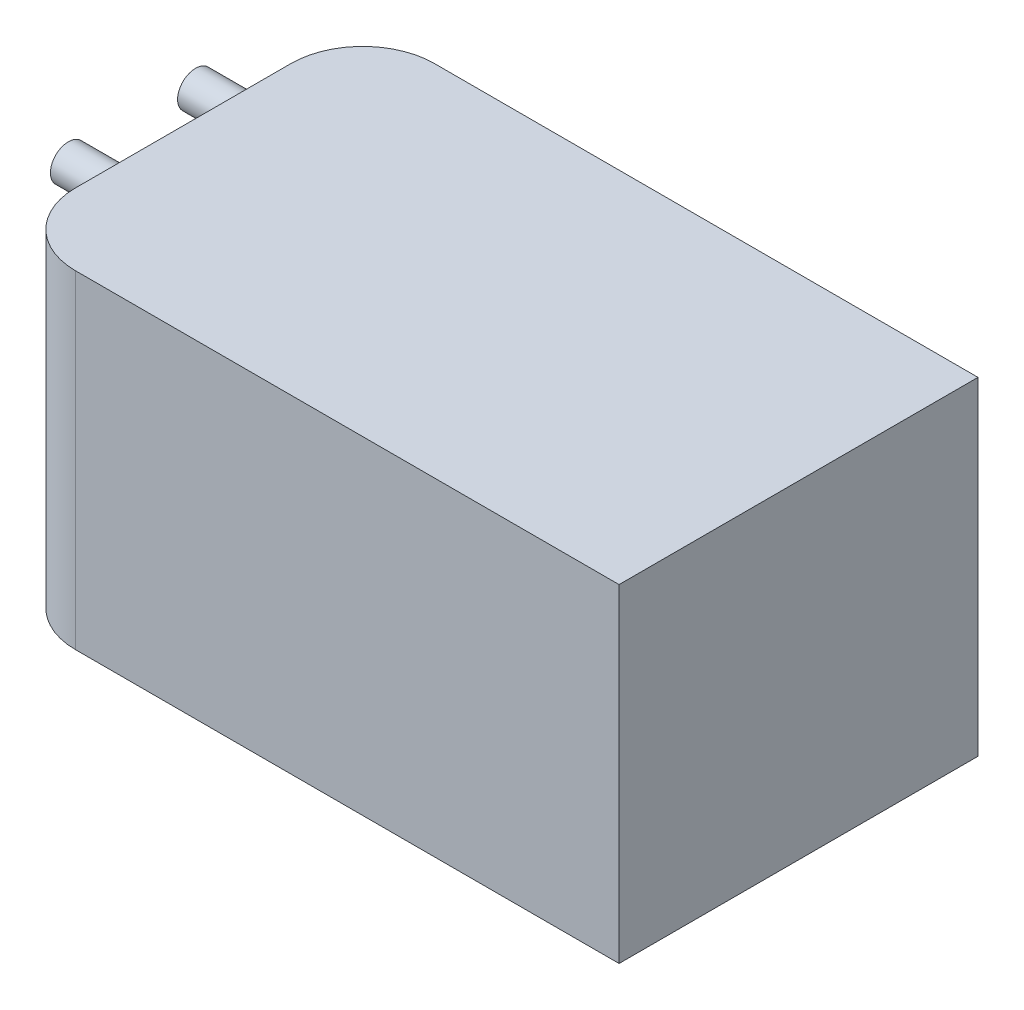
ISO-10303-21;
HEADER;
FILE_DESCRIPTION(('STEP AP214'),'2;1');
FILE_NAME('part.step','',(''),(''),'','','');
FILE_SCHEMA(('AUTOMOTIVE_DESIGN { 1 0 10303 214 1 1 1 1 }'));
ENDSEC;
DATA;
#1=APPLICATION_CONTEXT('core data for automotive mechanical design processes');
#2=APPLICATION_PROTOCOL_DEFINITION('international standard','automotive_design',2000,#1);
#3=PRODUCT_CONTEXT('',#1,'mechanical');
#4=PRODUCT('Part','Part','',(#3));
#5=PRODUCT_RELATED_PRODUCT_CATEGORY('part','',(#4));
#6=PRODUCT_DEFINITION_FORMATION('','',#4);
#7=PRODUCT_DEFINITION_CONTEXT('part definition',#1,'design');
#8=PRODUCT_DEFINITION('design','',#6,#7);
#9=PRODUCT_DEFINITION_SHAPE('','',#8);
#10=(LENGTH_UNIT() NAMED_UNIT(*) SI_UNIT(.MILLI.,.METRE.));
#11=(NAMED_UNIT(*) PLANE_ANGLE_UNIT() SI_UNIT($,.RADIAN.));
#12=(NAMED_UNIT(*) SI_UNIT($,.STERADIAN.) SOLID_ANGLE_UNIT());
#13=UNCERTAINTY_MEASURE_WITH_UNIT(LENGTH_MEASURE(1.E-05),#10,'distance_accuracy_value','');
#14=(GEOMETRIC_REPRESENTATION_CONTEXT(3) GLOBAL_UNCERTAINTY_ASSIGNED_CONTEXT((#13)) GLOBAL_UNIT_ASSIGNED_CONTEXT((#10,
#11,#12)) REPRESENTATION_CONTEXT('',''));
#15=CARTESIAN_POINT('',(0.,0.,0.));
#16=DIRECTION('',(0.,0.,1.));
#17=DIRECTION('',(1.,0.,0.));
#18=AXIS2_PLACEMENT_3D('',#15,#16,#17);
#19=CARTESIAN_POINT('',(30.,-16.,35.));
#20=DIRECTION('',(-1.,0.,0.));
#21=DIRECTION('',(0.,0.,1.));
#22=AXIS2_PLACEMENT_3D('',#19,#20,#21);
#23=PLANE('',#22);
#24=DIRECTION('',(0.,1.,0.));
#25=VECTOR('',#24,1.);
#26=CARTESIAN_POINT('',(30.,-16.,0.));
#27=LINE('',#26,#25);
#28=CARTESIAN_POINT('',(30.,-16.,0.));
#29=VERTEX_POINT('',#28);
#30=CARTESIAN_POINT('',(30.,16.,0.));
#31=VERTEX_POINT('',#30);
#32=EDGE_CURVE('E109',#29,#31,#27,.T.);
#33=ORIENTED_EDGE('',*,*,#32,.T.);
#34=DIRECTION('',(0.,0.,-1.));
#35=VECTOR('',#34,1.);
#36=CARTESIAN_POINT('',(30.,16.,35.));
#37=LINE('',#36,#35);
#38=CARTESIAN_POINT('',(30.,16.,35.));
#39=VERTEX_POINT('',#38);
#40=EDGE_CURVE('E92',#39,#31,#37,.T.);
#41=ORIENTED_EDGE('',*,*,#40,.F.);
#42=DIRECTION('',(0.,1.,0.));
#43=VECTOR('',#42,1.);
#44=CARTESIAN_POINT('',(30.,-16.,35.));
#45=LINE('',#44,#43);
#46=CARTESIAN_POINT('',(30.,-16.,35.));
#47=VERTEX_POINT('',#46);
#48=EDGE_CURVE('E98',#47,#39,#45,.T.);
#49=ORIENTED_EDGE('',*,*,#48,.F.);
#50=DIRECTION('',(0.,0.,-1.));
#51=VECTOR('',#50,1.);
#52=CARTESIAN_POINT('',(30.,-16.,35.));
#53=LINE('',#52,#51);
#54=EDGE_CURVE('E156',#47,#29,#53,.T.);
#55=ORIENTED_EDGE('',*,*,#54,.T.);
#56=EDGE_LOOP('',(#33,#41,#49,#55));
#57=FACE_BOUND('',#56,.T.);
#58=ADVANCED_FACE('F35',(#57),#23,.F.);
#59=CARTESIAN_POINT('',(-30.,16.,35.));
#60=DIRECTION('',(0.,-1.,0.));
#61=DIRECTION('',(0.,0.,-1.));
#62=AXIS2_PLACEMENT_3D('',#59,#60,#61);
#63=PLANE('',#62);
#64=DIRECTION('',(-1.,0.,0.));
#65=VECTOR('',#64,1.);
#66=CARTESIAN_POINT('',(-30.,16.,0.));
#67=LINE('',#66,#65);
#68=CARTESIAN_POINT('',(-23.,16.,0.));
#69=VERTEX_POINT('',#68);
#70=EDGE_CURVE('E151',#31,#69,#67,.T.);
#71=ORIENTED_EDGE('',*,*,#70,.T.);
#72=CARTESIAN_POINT('',(-23.,16.,7.));
#73=DIRECTION('',(0.,-1.,0.));
#74=DIRECTION('',(0.,0.,-1.));
#75=AXIS2_PLACEMENT_3D('',#72,#73,#74);
#76=CIRCLE('',#75,7.);
#77=CARTESIAN_POINT('',(-30.,16.,7.));
#78=VERTEX_POINT('',#77);
#79=EDGE_CURVE('E128',#69,#78,#76,.F.);
#80=ORIENTED_EDGE('',*,*,#79,.T.);
#81=DIRECTION('',(0.,0.,-1.));
#82=VECTOR('',#81,1.);
#83=CARTESIAN_POINT('',(-30.,16.,35.));
#84=LINE('',#83,#82);
#85=CARTESIAN_POINT('',(-30.,16.,28.));
#86=VERTEX_POINT('',#85);
#87=EDGE_CURVE('E111',#86,#78,#84,.T.);
#88=ORIENTED_EDGE('',*,*,#87,.F.);
#89=CARTESIAN_POINT('',(-23.,16.,28.));
#90=DIRECTION('',(0.,-1.,0.));
#91=DIRECTION('',(0.,0.,-1.));
#92=AXIS2_PLACEMENT_3D('',#89,#90,#91);
#93=CIRCLE('',#92,7.);
#94=CARTESIAN_POINT('',(-23.,16.,35.));
#95=VERTEX_POINT('',#94);
#96=EDGE_CURVE('E50',#86,#95,#93,.F.);
#97=ORIENTED_EDGE('',*,*,#96,.T.);
#98=DIRECTION('',(-1.,0.,0.));
#99=VECTOR('',#98,1.);
#100=CARTESIAN_POINT('',(-30.,16.,35.));
#101=LINE('',#100,#99);
#102=EDGE_CURVE('E88',#39,#95,#101,.T.);
#103=ORIENTED_EDGE('',*,*,#102,.F.);
#104=ORIENTED_EDGE('',*,*,#40,.T.);
#105=EDGE_LOOP('',(#71,#80,#88,#97,#103,#104));
#106=FACE_BOUND('',#105,.T.);
#107=ADVANCED_FACE('F90',(#106),#63,.F.);
#108=CARTESIAN_POINT('',(-30.,-16.,35.));
#109=DIRECTION('',(1.,0.,0.));
#110=DIRECTION('',(0.,0.,-1.));
#111=AXIS2_PLACEMENT_3D('',#108,#109,#110);
#112=PLANE('',#111);
#113=CARTESIAN_POINT('',(-30.,13.5,23.7));
#114=DIRECTION('',(1.,0.,0.));
#115=DIRECTION('',(0.,0.,-1.));
#116=AXIS2_PLACEMENT_3D('',#113,#114,#115);
#117=CIRCLE('',#116,1.75);
#118=CARTESIAN_POINT('',(-30.,13.5,21.95));
#119=VERTEX_POINT('',#118);
#120=EDGE_CURVE('E11',#119,#119,#117,.F.);
#121=ORIENTED_EDGE('',*,*,#120,.F.);
#122=EDGE_LOOP('',(#121));
#123=FACE_BOUND('',#122,.T.);
#124=CARTESIAN_POINT('',(-30.,13.5,11.3));
#125=DIRECTION('',(1.,0.,0.));
#126=DIRECTION('',(0.,0.,-1.));
#127=AXIS2_PLACEMENT_3D('',#124,#125,#126);
#128=CIRCLE('',#127,1.75);
#129=CARTESIAN_POINT('',(-30.,13.5,9.55));
#130=VERTEX_POINT('',#129);
#131=EDGE_CURVE('E43',#130,#130,#128,.F.);
#132=ORIENTED_EDGE('',*,*,#131,.F.);
#133=EDGE_LOOP('',(#132));
#134=FACE_BOUND('',#133,.T.);
#135=ORIENTED_EDGE('',*,*,#87,.T.);
#136=DIRECTION('',(0.,-1.,0.));
#137=VECTOR('',#136,1.);
#138=CARTESIAN_POINT('',(-30.,-16.,7.));
#139=LINE('',#138,#137);
#140=CARTESIAN_POINT('',(-30.,-16.,7.));
#141=VERTEX_POINT('',#140);
#142=EDGE_CURVE('E113',#78,#141,#139,.T.);
#143=ORIENTED_EDGE('',*,*,#142,.T.);
#144=DIRECTION('',(0.,0.,-1.));
#145=VECTOR('',#144,1.);
#146=CARTESIAN_POINT('',(-30.,-16.,35.));
#147=LINE('',#146,#145);
#148=CARTESIAN_POINT('',(-30.,-16.,28.));
#149=VERTEX_POINT('',#148);
#150=EDGE_CURVE('E116',#149,#141,#147,.T.);
#151=ORIENTED_EDGE('',*,*,#150,.F.);
#152=DIRECTION('',(0.,-1.,0.));
#153=VECTOR('',#152,1.);
#154=CARTESIAN_POINT('',(-30.,-16.,28.));
#155=LINE('',#154,#153);
#156=EDGE_CURVE('E110',#149,#86,#155,.F.);
#157=ORIENTED_EDGE('',*,*,#156,.T.);
#158=EDGE_LOOP('',(#135,#143,#151,#157));
#159=FACE_BOUND('',#158,.T.);
#160=ADVANCED_FACE('F136',(#123,#134,#159),#112,.F.);
#161=CARTESIAN_POINT('',(-30.,-16.,35.));
#162=DIRECTION('',(0.,1.,0.));
#163=DIRECTION('',(0.,0.,1.));
#164=AXIS2_PLACEMENT_3D('',#161,#162,#163);
#165=PLANE('',#164);
#166=ORIENTED_EDGE('',*,*,#150,.T.);
#167=CARTESIAN_POINT('',(-23.,-16.,7.));
#168=DIRECTION('',(0.,1.,0.));
#169=DIRECTION('',(0.,0.,1.));
#170=AXIS2_PLACEMENT_3D('',#167,#168,#169);
#171=CIRCLE('',#170,7.);
#172=CARTESIAN_POINT('',(-23.,-16.,0.));
#173=VERTEX_POINT('',#172);
#174=EDGE_CURVE('E124',#141,#173,#171,.F.);
#175=ORIENTED_EDGE('',*,*,#174,.T.);
#176=DIRECTION('',(1.,0.,0.));
#177=VECTOR('',#176,1.);
#178=CARTESIAN_POINT('',(-30.,-16.,0.));
#179=LINE('',#178,#177);
#180=EDGE_CURVE('E106',#173,#29,#179,.T.);
#181=ORIENTED_EDGE('',*,*,#180,.T.);
#182=ORIENTED_EDGE('',*,*,#54,.F.);
#183=DIRECTION('',(1.,0.,0.));
#184=VECTOR('',#183,1.);
#185=CARTESIAN_POINT('',(-30.,-16.,35.));
#186=LINE('',#185,#184);
#187=CARTESIAN_POINT('',(-23.,-16.,35.));
#188=VERTEX_POINT('',#187);
#189=EDGE_CURVE('E97',#188,#47,#186,.T.);
#190=ORIENTED_EDGE('',*,*,#189,.F.);
#191=CARTESIAN_POINT('',(-23.,-16.,28.));
#192=DIRECTION('',(0.,1.,0.));
#193=DIRECTION('',(0.,0.,1.));
#194=AXIS2_PLACEMENT_3D('',#191,#192,#193);
#195=CIRCLE('',#194,7.);
#196=EDGE_CURVE('E122',#188,#149,#195,.F.);
#197=ORIENTED_EDGE('',*,*,#196,.T.);
#198=EDGE_LOOP('',(#166,#175,#181,#182,#190,#197));
#199=FACE_BOUND('',#198,.T.);
#200=ADVANCED_FACE('F139',(#199),#165,.F.);
#201=CARTESIAN_POINT('',(0.,0.,35.));
#202=DIRECTION('',(0.,0.,-1.));
#203=DIRECTION('',(-1.,0.,0.));
#204=AXIS2_PLACEMENT_3D('',#201,#202,#203);
#205=PLANE('',#204);
#206=ORIENTED_EDGE('',*,*,#102,.T.);
#207=DIRECTION('',(0.,-1.,0.));
#208=VECTOR('',#207,1.);
#209=CARTESIAN_POINT('',(-23.,0.,35.));
#210=LINE('',#209,#208);
#211=EDGE_CURVE('E130',#95,#188,#210,.T.);
#212=ORIENTED_EDGE('',*,*,#211,.T.);
#213=ORIENTED_EDGE('',*,*,#189,.T.);
#214=ORIENTED_EDGE('',*,*,#48,.T.);
#215=EDGE_LOOP('',(#206,#212,#213,#214));
#216=FACE_BOUND('',#215,.T.);
#217=ADVANCED_FACE('F101',(#216),#205,.F.);
#218=CARTESIAN_POINT('',(0.,0.,0.));
#219=DIRECTION('',(0.,0.,-1.));
#220=DIRECTION('',(-1.,0.,0.));
#221=AXIS2_PLACEMENT_3D('',#218,#219,#220);
#222=PLANE('',#221);
#223=ORIENTED_EDGE('',*,*,#180,.F.);
#224=DIRECTION('',(0.,-1.,0.));
#225=VECTOR('',#224,1.);
#226=CARTESIAN_POINT('',(-23.,16.,0.));
#227=LINE('',#226,#225);
#228=EDGE_CURVE('E58',#173,#69,#227,.F.);
#229=ORIENTED_EDGE('',*,*,#228,.T.);
#230=ORIENTED_EDGE('',*,*,#70,.F.);
#231=ORIENTED_EDGE('',*,*,#32,.F.);
#232=EDGE_LOOP('',(#223,#229,#230,#231));
#233=FACE_BOUND('',#232,.T.);
#234=ADVANCED_FACE('F150',(#233),#222,.T.);
#235=CARTESIAN_POINT('',(-23.,-16.,7.));
#236=DIRECTION('',(0.,1.,0.));
#237=DIRECTION('',(0.,0.,1.));
#238=AXIS2_PLACEMENT_3D('',#235,#236,#237);
#239=CYLINDRICAL_SURFACE('',#238,7.);
#240=ORIENTED_EDGE('',*,*,#79,.F.);
#241=ORIENTED_EDGE('',*,*,#228,.F.);
#242=ORIENTED_EDGE('',*,*,#174,.F.);
#243=ORIENTED_EDGE('',*,*,#142,.F.);
#244=EDGE_LOOP('',(#240,#241,#242,#243));
#245=FACE_BOUND('',#244,.T.);
#246=ADVANCED_FACE('F148',(#245),#239,.T.);
#247=CARTESIAN_POINT('',(-23.,0.,28.));
#248=DIRECTION('',(0.,-1.,0.));
#249=DIRECTION('',(0.,0.,-1.));
#250=AXIS2_PLACEMENT_3D('',#247,#248,#249);
#251=CYLINDRICAL_SURFACE('',#250,7.);
#252=ORIENTED_EDGE('',*,*,#96,.F.);
#253=ORIENTED_EDGE('',*,*,#156,.F.);
#254=ORIENTED_EDGE('',*,*,#196,.F.);
#255=ORIENTED_EDGE('',*,*,#211,.F.);
#256=EDGE_LOOP('',(#252,#253,#254,#255));
#257=FACE_BOUND('',#256,.T.);
#258=ADVANCED_FACE('F37',(#257),#251,.T.);
#259=CARTESIAN_POINT('',(-35.,13.5,11.3));
#260=DIRECTION('',(1.,0.,0.));
#261=DIRECTION('',(0.,0.,-1.));
#262=AXIS2_PLACEMENT_3D('',#259,#260,#261);
#263=CYLINDRICAL_SURFACE('',#262,1.75);
#264=CARTESIAN_POINT('',(-35.,13.5,11.3));
#265=DIRECTION('',(-1.,0.,0.));
#266=DIRECTION('',(0.,0.,1.));
#267=AXIS2_PLACEMENT_3D('',#264,#265,#266);
#268=CIRCLE('',#267,1.75);
#269=CARTESIAN_POINT('',(-35.,13.5,13.05));
#270=VERTEX_POINT('',#269);
#271=EDGE_CURVE('E158',#270,#270,#268,.T.);
#272=ORIENTED_EDGE('',*,*,#271,.F.);
#273=EDGE_LOOP('',(#272));
#274=FACE_BOUND('',#273,.T.);
#275=ORIENTED_EDGE('',*,*,#131,.T.);
#276=EDGE_LOOP('',(#275));
#277=FACE_BOUND('',#276,.T.);
#278=ADVANCED_FACE('F134',(#274,#277),#263,.T.);
#279=CARTESIAN_POINT('',(-35.,13.5,11.3));
#280=DIRECTION('',(-1.,0.,0.));
#281=DIRECTION('',(0.,0.,1.));
#282=AXIS2_PLACEMENT_3D('',#279,#280,#281);
#283=PLANE('',#282);
#284=ORIENTED_EDGE('',*,*,#271,.T.);
#285=EDGE_LOOP('',(#284));
#286=FACE_BOUND('',#285,.T.);
#287=ADVANCED_FACE('F173',(#286),#283,.T.);
#288=CARTESIAN_POINT('',(-35.,13.5,23.7));
#289=DIRECTION('',(1.,0.,0.));
#290=DIRECTION('',(0.,0.,-1.));
#291=AXIS2_PLACEMENT_3D('',#288,#289,#290);
#292=CYLINDRICAL_SURFACE('',#291,1.75);
#293=CARTESIAN_POINT('',(-35.,13.5,23.7));
#294=DIRECTION('',(-1.,0.,0.));
#295=DIRECTION('',(0.,0.,1.));
#296=AXIS2_PLACEMENT_3D('',#293,#294,#295);
#297=CIRCLE('',#296,1.75);
#298=CARTESIAN_POINT('',(-35.,13.5,25.45));
#299=VERTEX_POINT('',#298);
#300=EDGE_CURVE('E160',#299,#299,#297,.T.);
#301=ORIENTED_EDGE('',*,*,#300,.F.);
#302=EDGE_LOOP('',(#301));
#303=FACE_BOUND('',#302,.T.);
#304=ORIENTED_EDGE('',*,*,#120,.T.);
#305=EDGE_LOOP('',(#304));
#306=FACE_BOUND('',#305,.T.);
#307=ADVANCED_FACE('F170',(#303,#306),#292,.T.);
#308=CARTESIAN_POINT('',(-35.,13.5,23.7));
#309=DIRECTION('',(-1.,0.,0.));
#310=DIRECTION('',(0.,0.,1.));
#311=AXIS2_PLACEMENT_3D('',#308,#309,#310);
#312=PLANE('',#311);
#313=ORIENTED_EDGE('',*,*,#300,.T.);
#314=EDGE_LOOP('',(#313));
#315=FACE_BOUND('',#314,.T.);
#316=ADVANCED_FACE('F168',(#315),#312,.T.);
#317=CLOSED_SHELL('',(#58,#107,#160,#200,#217,#234,#246,#258,#278,#287,#307,#316));
#318=MANIFOLD_SOLID_BREP('B2',#317);
#319=ADVANCED_BREP_SHAPE_REPRESENTATION('',(#18,#318),#14);
#320=SHAPE_DEFINITION_REPRESENTATION(#9,#319);
ENDSEC;
END-ISO-10303-21;
